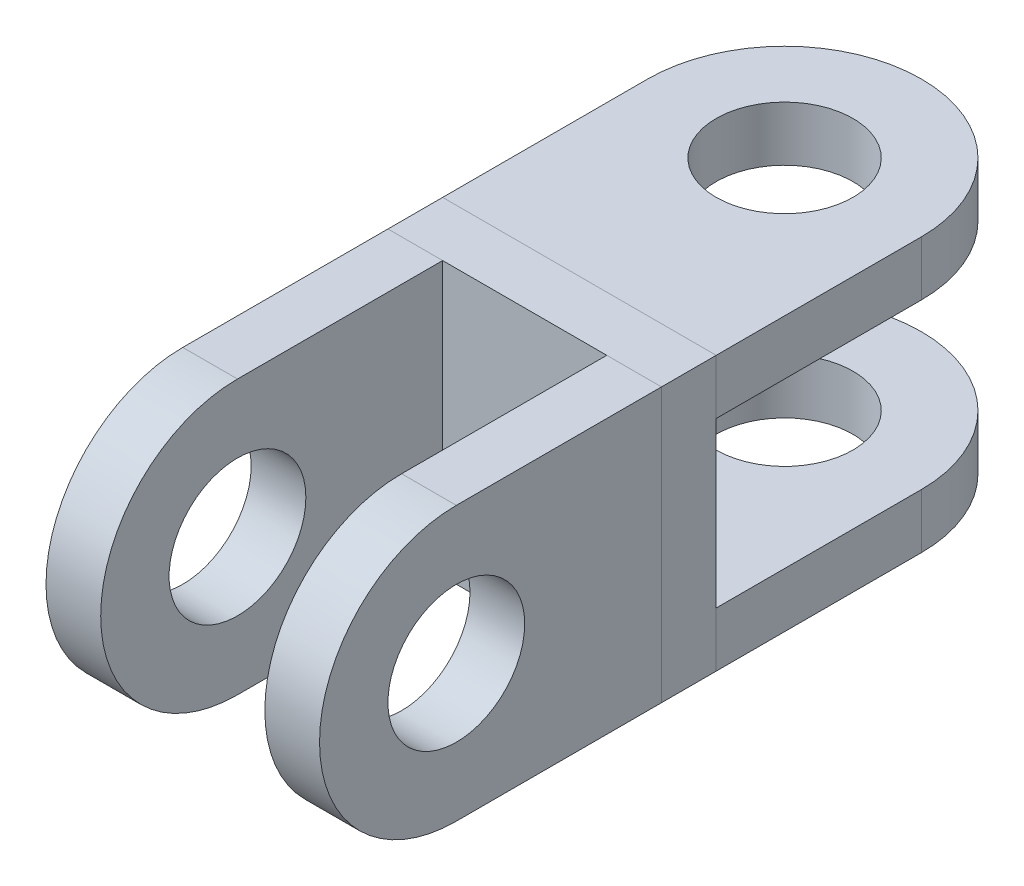
ISO-10303-21;
HEADER;
FILE_DESCRIPTION(('STEP AP214'),'2;1');
FILE_NAME('part.step','',(''),(''),'','','');
FILE_SCHEMA(('AUTOMOTIVE_DESIGN { 1 0 10303 214 1 1 1 1 }'));
ENDSEC;
DATA;
#1=APPLICATION_CONTEXT('core data for automotive mechanical design processes');
#2=APPLICATION_PROTOCOL_DEFINITION('international standard','automotive_design',2000,#1);
#3=PRODUCT_CONTEXT('',#1,'mechanical');
#4=PRODUCT('Part','Part','',(#3));
#5=PRODUCT_RELATED_PRODUCT_CATEGORY('part','',(#4));
#6=PRODUCT_DEFINITION_FORMATION('','',#4);
#7=PRODUCT_DEFINITION_CONTEXT('part definition',#1,'design');
#8=PRODUCT_DEFINITION('design','',#6,#7);
#9=PRODUCT_DEFINITION_SHAPE('','',#8);
#10=(LENGTH_UNIT() NAMED_UNIT(*) SI_UNIT(.MILLI.,.METRE.));
#11=(NAMED_UNIT(*) PLANE_ANGLE_UNIT() SI_UNIT($,.RADIAN.));
#12=(NAMED_UNIT(*) SI_UNIT($,.STERADIAN.) SOLID_ANGLE_UNIT());
#13=UNCERTAINTY_MEASURE_WITH_UNIT(LENGTH_MEASURE(1.E-05),#10,'distance_accuracy_value','');
#14=(GEOMETRIC_REPRESENTATION_CONTEXT(3) GLOBAL_UNCERTAINTY_ASSIGNED_CONTEXT((#13)) GLOBAL_UNIT_ASSIGNED_CONTEXT((#10,
#11,#12)) REPRESENTATION_CONTEXT('',''));
#15=CARTESIAN_POINT('',(0.,0.,0.));
#16=DIRECTION('',(0.,0.,1.));
#17=DIRECTION('',(1.,0.,0.));
#18=AXIS2_PLACEMENT_3D('',#15,#16,#17);
#19=CARTESIAN_POINT('',(0.,6.,-15.));
#20=DIRECTION('',(0.,-1.,0.));
#21=DIRECTION('',(0.,0.,1.));
#22=AXIS2_PLACEMENT_3D('',#19,#20,#21);
#23=PLANE('',#22);
#24=CARTESIAN_POINT('',(0.,6.,-15.));
#25=DIRECTION('',(0.,1.,0.));
#26=DIRECTION('',(0.,0.,1.));
#27=AXIS2_PLACEMENT_3D('',#24,#25,#26);
#28=CIRCLE('',#27,10.);
#29=CARTESIAN_POINT('',(10.,6.,-15.));
#30=VERTEX_POINT('',#29);
#31=CARTESIAN_POINT('',(-10.,6.,-15.));
#32=VERTEX_POINT('',#31);
#33=EDGE_CURVE('E103',#30,#32,#28,.T.);
#34=ORIENTED_EDGE('',*,*,#33,.F.);
#35=DIRECTION('',(0.,0.,-1.));
#36=VECTOR('',#35,1.);
#37=CARTESIAN_POINT('',(10.,6.,0.));
#38=LINE('',#37,#36);
#39=CARTESIAN_POINT('',(10.,6.,0.));
#40=VERTEX_POINT('',#39);
#41=EDGE_CURVE('E106',#40,#30,#38,.T.);
#42=ORIENTED_EDGE('',*,*,#41,.F.);
#43=DIRECTION('',(1.,0.,0.));
#44=VECTOR('',#43,1.);
#45=CARTESIAN_POINT('',(-10.,6.,0.));
#46=LINE('',#45,#44);
#47=CARTESIAN_POINT('',(-10.,6.,0.));
#48=VERTEX_POINT('',#47);
#49=EDGE_CURVE('E94',#48,#40,#46,.T.);
#50=ORIENTED_EDGE('',*,*,#49,.F.);
#51=DIRECTION('',(0.,0.,1.));
#52=VECTOR('',#51,1.);
#53=CARTESIAN_POINT('',(-10.,6.,-15.));
#54=LINE('',#53,#52);
#55=EDGE_CURVE('E99',#32,#48,#54,.T.);
#56=ORIENTED_EDGE('',*,*,#55,.F.);
#57=EDGE_LOOP('',(#34,#42,#50,#56));
#58=FACE_BOUND('',#57,.T.);
#59=CARTESIAN_POINT('',(0.,6.,-15.));
#60=DIRECTION('',(0.,1.,0.));
#61=DIRECTION('',(0.,0.,1.));
#62=AXIS2_PLACEMENT_3D('',#59,#60,#61);
#63=CIRCLE('',#62,5.);
#64=CARTESIAN_POINT('',(0.,6.,-10.));
#65=VERTEX_POINT('',#64);
#66=EDGE_CURVE('E115',#65,#65,#63,.T.);
#67=ORIENTED_EDGE('',*,*,#66,.T.);
#68=EDGE_LOOP('',(#67));
#69=FACE_BOUND('',#68,.T.);
#70=ADVANCED_FACE('F47',(#58,#69),#23,.T.);
#71=CARTESIAN_POINT('',(0.,10.,-15.));
#72=DIRECTION('',(0.,-1.,0.));
#73=DIRECTION('',(0.,0.,1.));
#74=AXIS2_PLACEMENT_3D('',#71,#72,#73);
#75=PLANE('',#74);
#76=CARTESIAN_POINT('',(0.,10.,-15.));
#77=DIRECTION('',(0.,1.,0.));
#78=DIRECTION('',(0.,0.,1.));
#79=AXIS2_PLACEMENT_3D('',#76,#77,#78);
#80=CIRCLE('',#79,10.);
#81=CARTESIAN_POINT('',(10.,10.,-15.));
#82=VERTEX_POINT('',#81);
#83=CARTESIAN_POINT('',(-10.,10.,-15.));
#84=VERTEX_POINT('',#83);
#85=EDGE_CURVE('E111',#82,#84,#80,.T.);
#86=ORIENTED_EDGE('',*,*,#85,.T.);
#87=DIRECTION('',(0.,0.,1.));
#88=VECTOR('',#87,1.);
#89=CARTESIAN_POINT('',(-10.,10.,-15.));
#90=LINE('',#89,#88);
#91=CARTESIAN_POINT('',(-10.,10.,0.));
#92=VERTEX_POINT('',#91);
#93=EDGE_CURVE('E114',#84,#92,#90,.T.);
#94=ORIENTED_EDGE('',*,*,#93,.T.);
#95=DIRECTION('',(1.,0.,0.));
#96=VECTOR('',#95,1.);
#97=CARTESIAN_POINT('',(-10.,10.,0.));
#98=LINE('',#97,#96);
#99=CARTESIAN_POINT('',(10.,10.,0.));
#100=VERTEX_POINT('',#99);
#101=EDGE_CURVE('E97',#92,#100,#98,.T.);
#102=ORIENTED_EDGE('',*,*,#101,.T.);
#103=DIRECTION('',(0.,0.,-1.));
#104=VECTOR('',#103,1.);
#105=CARTESIAN_POINT('',(10.,10.,0.));
#106=LINE('',#105,#104);
#107=EDGE_CURVE('E118',#100,#82,#106,.T.);
#108=ORIENTED_EDGE('',*,*,#107,.T.);
#109=EDGE_LOOP('',(#86,#94,#102,#108));
#110=FACE_BOUND('',#109,.T.);
#111=CARTESIAN_POINT('',(0.,10.,-15.));
#112=DIRECTION('',(0.,1.,0.));
#113=DIRECTION('',(0.,0.,1.));
#114=AXIS2_PLACEMENT_3D('',#111,#112,#113);
#115=CIRCLE('',#114,5.);
#116=CARTESIAN_POINT('',(0.,10.,-10.));
#117=VERTEX_POINT('',#116);
#118=EDGE_CURVE('E123',#117,#117,#115,.T.);
#119=ORIENTED_EDGE('',*,*,#118,.F.);
#120=EDGE_LOOP('',(#119));
#121=FACE_BOUND('',#120,.T.);
#122=ADVANCED_FACE('F136',(#110,#121),#75,.F.);
#123=CARTESIAN_POINT('',(0.,6.,-15.));
#124=DIRECTION('',(0.,1.,0.));
#125=DIRECTION('',(0.,0.,-1.));
#126=AXIS2_PLACEMENT_3D('',#123,#124,#125);
#127=CYLINDRICAL_SURFACE('',#126,10.);
#128=ORIENTED_EDGE('',*,*,#85,.F.);
#129=DIRECTION('',(0.,1.,0.));
#130=VECTOR('',#129,1.);
#131=CARTESIAN_POINT('',(10.,6.,-15.));
#132=LINE('',#131,#130);
#133=EDGE_CURVE('E64',#30,#82,#132,.T.);
#134=ORIENTED_EDGE('',*,*,#133,.F.);
#135=ORIENTED_EDGE('',*,*,#33,.T.);
#136=DIRECTION('',(0.,1.,0.));
#137=VECTOR('',#136,1.);
#138=CARTESIAN_POINT('',(-10.,6.,-15.));
#139=LINE('',#138,#137);
#140=EDGE_CURVE('E12',#32,#84,#139,.T.);
#141=ORIENTED_EDGE('',*,*,#140,.T.);
#142=EDGE_LOOP('',(#128,#134,#135,#141));
#143=FACE_BOUND('',#142,.T.);
#144=ADVANCED_FACE('F49',(#143),#127,.T.);
#145=CARTESIAN_POINT('',(-10.,6.,-15.));
#146=DIRECTION('',(1.,0.,0.));
#147=DIRECTION('',(0.,-1.,0.));
#148=AXIS2_PLACEMENT_3D('',#145,#146,#147);
#149=PLANE('',#148);
#150=ORIENTED_EDGE('',*,*,#93,.F.);
#151=ORIENTED_EDGE('',*,*,#140,.F.);
#152=ORIENTED_EDGE('',*,*,#55,.T.);
#153=DIRECTION('',(0.,1.,0.));
#154=VECTOR('',#153,1.);
#155=CARTESIAN_POINT('',(-10.,6.,0.));
#156=LINE('',#155,#154);
#157=EDGE_CURVE('E56',#48,#92,#156,.T.);
#158=ORIENTED_EDGE('',*,*,#157,.T.);
#159=EDGE_LOOP('',(#150,#151,#152,#158));
#160=FACE_BOUND('',#159,.T.);
#161=ADVANCED_FACE('F100',(#160),#149,.F.);
#162=CARTESIAN_POINT('',(-10.,6.,0.));
#163=DIRECTION('',(0.,0.,-1.));
#164=DIRECTION('',(0.,-1.,0.));
#165=AXIS2_PLACEMENT_3D('',#162,#163,#164);
#166=PLANE('',#165);
#167=ORIENTED_EDGE('',*,*,#101,.F.);
#168=ORIENTED_EDGE('',*,*,#157,.F.);
#169=ORIENTED_EDGE('',*,*,#49,.T.);
#170=DIRECTION('',(0.,1.,0.));
#171=VECTOR('',#170,1.);
#172=CARTESIAN_POINT('',(10.,6.,0.));
#173=LINE('',#172,#171);
#174=EDGE_CURVE('E80',#40,#100,#173,.T.);
#175=ORIENTED_EDGE('',*,*,#174,.T.);
#176=EDGE_LOOP('',(#167,#168,#169,#175));
#177=FACE_BOUND('',#176,.T.);
#178=ADVANCED_FACE('F92',(#177),#166,.F.);
#179=CARTESIAN_POINT('',(10.,6.,0.));
#180=DIRECTION('',(-1.,0.,0.));
#181=DIRECTION('',(0.,1.,0.));
#182=AXIS2_PLACEMENT_3D('',#179,#180,#181);
#183=PLANE('',#182);
#184=ORIENTED_EDGE('',*,*,#107,.F.);
#185=ORIENTED_EDGE('',*,*,#174,.F.);
#186=ORIENTED_EDGE('',*,*,#41,.T.);
#187=ORIENTED_EDGE('',*,*,#133,.T.);
#188=EDGE_LOOP('',(#184,#185,#186,#187));
#189=FACE_BOUND('',#188,.T.);
#190=ADVANCED_FACE('F132',(#189),#183,.F.);
#191=CARTESIAN_POINT('',(0.,6.,-15.));
#192=DIRECTION('',(0.,1.,0.));
#193=DIRECTION('',(0.,0.,-1.));
#194=AXIS2_PLACEMENT_3D('',#191,#192,#193);
#195=CYLINDRICAL_SURFACE('',#194,5.);
#196=ORIENTED_EDGE('',*,*,#66,.F.);
#197=EDGE_LOOP('',(#196));
#198=FACE_BOUND('',#197,.T.);
#199=ORIENTED_EDGE('',*,*,#118,.T.);
#200=EDGE_LOOP('',(#199));
#201=FACE_BOUND('',#200,.T.);
#202=ADVANCED_FACE('F129',(#198,#201),#195,.F.);
#203=CLOSED_SHELL('',(#70,#122,#144,#161,#178,#190,#202));
#204=MANIFOLD_SOLID_BREP('B2',#203);
#205=CARTESIAN_POINT('',(0.,-6.,-15.));
#206=DIRECTION('',(0.,1.,0.));
#207=DIRECTION('',(0.,0.,1.));
#208=AXIS2_PLACEMENT_3D('',#205,#206,#207);
#209=PLANE('',#208);
#210=CARTESIAN_POINT('',(0.,-6.,-15.));
#211=DIRECTION('',(0.,1.,0.));
#212=DIRECTION('',(0.,0.,1.));
#213=AXIS2_PLACEMENT_3D('',#210,#211,#212);
#214=CIRCLE('',#213,10.);
#215=CARTESIAN_POINT('',(10.,-6.,-15.));
#216=VERTEX_POINT('',#215);
#217=CARTESIAN_POINT('',(-10.,-6.,-15.));
#218=VERTEX_POINT('',#217);
#219=EDGE_CURVE('E253',#216,#218,#214,.T.);
#220=ORIENTED_EDGE('',*,*,#219,.T.);
#221=DIRECTION('',(0.,0.,1.));
#222=VECTOR('',#221,1.);
#223=CARTESIAN_POINT('',(-10.,-6.,-15.));
#224=LINE('',#223,#222);
#225=CARTESIAN_POINT('',(-10.,-6.,0.));
#226=VERTEX_POINT('',#225);
#227=EDGE_CURVE('E248',#218,#226,#224,.T.);
#228=ORIENTED_EDGE('',*,*,#227,.T.);
#229=DIRECTION('',(1.,0.,0.));
#230=VECTOR('',#229,1.);
#231=CARTESIAN_POINT('',(-10.,-6.,0.));
#232=LINE('',#231,#230);
#233=CARTESIAN_POINT('',(10.,-6.,0.));
#234=VERTEX_POINT('',#233);
#235=EDGE_CURVE('E251',#226,#234,#232,.T.);
#236=ORIENTED_EDGE('',*,*,#235,.T.);
#237=DIRECTION('',(0.,0.,-1.));
#238=VECTOR('',#237,1.);
#239=CARTESIAN_POINT('',(10.,-6.,0.));
#240=LINE('',#239,#238);
#241=EDGE_CURVE('E218',#234,#216,#240,.T.);
#242=ORIENTED_EDGE('',*,*,#241,.T.);
#243=EDGE_LOOP('',(#220,#228,#236,#242));
#244=FACE_BOUND('',#243,.T.);
#245=CARTESIAN_POINT('',(0.,-6.,-15.));
#246=DIRECTION('',(0.,1.,0.));
#247=DIRECTION('',(0.,0.,1.));
#248=AXIS2_PLACEMENT_3D('',#245,#246,#247);
#249=CIRCLE('',#248,5.);
#250=CARTESIAN_POINT('',(0.,-6.,-10.));
#251=VERTEX_POINT('',#250);
#252=EDGE_CURVE('E268',#251,#251,#249,.T.);
#253=ORIENTED_EDGE('',*,*,#252,.F.);
#254=EDGE_LOOP('',(#253));
#255=FACE_BOUND('',#254,.T.);
#256=ADVANCED_FACE('F201',(#244,#255),#209,.T.);
#257=CARTESIAN_POINT('',(0.,-10.,-15.));
#258=DIRECTION('',(0.,1.,0.));
#259=DIRECTION('',(0.,0.,1.));
#260=AXIS2_PLACEMENT_3D('',#257,#258,#259);
#261=PLANE('',#260);
#262=CARTESIAN_POINT('',(0.,-10.,-15.));
#263=DIRECTION('',(0.,1.,0.));
#264=DIRECTION('',(0.,0.,1.));
#265=AXIS2_PLACEMENT_3D('',#262,#263,#264);
#266=CIRCLE('',#265,10.);
#267=CARTESIAN_POINT('',(10.,-10.,-15.));
#268=VERTEX_POINT('',#267);
#269=CARTESIAN_POINT('',(-10.,-10.,-15.));
#270=VERTEX_POINT('',#269);
#271=EDGE_CURVE('E265',#268,#270,#266,.T.);
#272=ORIENTED_EDGE('',*,*,#271,.F.);
#273=DIRECTION('',(0.,0.,-1.));
#274=VECTOR('',#273,1.);
#275=CARTESIAN_POINT('',(10.,-10.,0.));
#276=LINE('',#275,#274);
#277=CARTESIAN_POINT('',(10.,-10.,0.));
#278=VERTEX_POINT('',#277);
#279=EDGE_CURVE('E241',#278,#268,#276,.T.);
#280=ORIENTED_EDGE('',*,*,#279,.F.);
#281=DIRECTION('',(1.,0.,0.));
#282=VECTOR('',#281,1.);
#283=CARTESIAN_POINT('',(-10.,-10.,0.));
#284=LINE('',#283,#282);
#285=CARTESIAN_POINT('',(-10.,-10.,0.));
#286=VERTEX_POINT('',#285);
#287=EDGE_CURVE('E235',#286,#278,#284,.T.);
#288=ORIENTED_EDGE('',*,*,#287,.F.);
#289=DIRECTION('',(0.,0.,1.));
#290=VECTOR('',#289,1.);
#291=CARTESIAN_POINT('',(-10.,-10.,-15.));
#292=LINE('',#291,#290);
#293=EDGE_CURVE('E257',#270,#286,#292,.T.);
#294=ORIENTED_EDGE('',*,*,#293,.F.);
#295=EDGE_LOOP('',(#272,#280,#288,#294));
#296=FACE_BOUND('',#295,.T.);
#297=CARTESIAN_POINT('',(0.,-10.,-15.));
#298=DIRECTION('',(0.,1.,0.));
#299=DIRECTION('',(0.,0.,1.));
#300=AXIS2_PLACEMENT_3D('',#297,#298,#299);
#301=CIRCLE('',#300,5.);
#302=CARTESIAN_POINT('',(0.,-10.,-10.));
#303=VERTEX_POINT('',#302);
#304=EDGE_CURVE('E280',#303,#303,#301,.T.);
#305=ORIENTED_EDGE('',*,*,#304,.T.);
#306=EDGE_LOOP('',(#305));
#307=FACE_BOUND('',#306,.T.);
#308=ADVANCED_FACE('F276',(#296,#307),#261,.F.);
#309=CARTESIAN_POINT('',(0.,-6.,-15.));
#310=DIRECTION('',(0.,-1.,0.));
#311=DIRECTION('',(0.,0.,-1.));
#312=AXIS2_PLACEMENT_3D('',#309,#310,#311);
#313=CYLINDRICAL_SURFACE('',#312,10.);
#314=ORIENTED_EDGE('',*,*,#271,.T.);
#315=DIRECTION('',(0.,-1.,0.));
#316=VECTOR('',#315,1.);
#317=CARTESIAN_POINT('',(-10.,-6.,-15.));
#318=LINE('',#317,#316);
#319=EDGE_CURVE('E45',#218,#270,#318,.T.);
#320=ORIENTED_EDGE('',*,*,#319,.F.);
#321=ORIENTED_EDGE('',*,*,#219,.F.);
#322=DIRECTION('',(0.,-1.,0.));
#323=VECTOR('',#322,1.);
#324=CARTESIAN_POINT('',(10.,-6.,-15.));
#325=LINE('',#324,#323);
#326=EDGE_CURVE('E261',#216,#268,#325,.T.);
#327=ORIENTED_EDGE('',*,*,#326,.T.);
#328=EDGE_LOOP('',(#314,#320,#321,#327));
#329=FACE_BOUND('',#328,.T.);
#330=ADVANCED_FACE('F203',(#329),#313,.T.);
#331=CARTESIAN_POINT('',(-10.,-6.,-15.));
#332=DIRECTION('',(1.,0.,0.));
#333=DIRECTION('',(0.,1.,0.));
#334=AXIS2_PLACEMENT_3D('',#331,#332,#333);
#335=PLANE('',#334);
#336=ORIENTED_EDGE('',*,*,#293,.T.);
#337=DIRECTION('',(0.,-1.,0.));
#338=VECTOR('',#337,1.);
#339=CARTESIAN_POINT('',(-10.,-6.,0.));
#340=LINE('',#339,#338);
#341=EDGE_CURVE('E210',#226,#286,#340,.T.);
#342=ORIENTED_EDGE('',*,*,#341,.F.);
#343=ORIENTED_EDGE('',*,*,#227,.F.);
#344=ORIENTED_EDGE('',*,*,#319,.T.);
#345=EDGE_LOOP('',(#336,#342,#343,#344));
#346=FACE_BOUND('',#345,.T.);
#347=ADVANCED_FACE('F256',(#346),#335,.F.);
#348=CARTESIAN_POINT('',(-10.,-6.,0.));
#349=DIRECTION('',(0.,0.,-1.));
#350=DIRECTION('',(0.,1.,0.));
#351=AXIS2_PLACEMENT_3D('',#348,#349,#350);
#352=PLANE('',#351);
#353=ORIENTED_EDGE('',*,*,#287,.T.);
#354=DIRECTION('',(0.,-1.,0.));
#355=VECTOR('',#354,1.);
#356=CARTESIAN_POINT('',(10.,-6.,0.));
#357=LINE('',#356,#355);
#358=EDGE_CURVE('E258',#234,#278,#357,.T.);
#359=ORIENTED_EDGE('',*,*,#358,.F.);
#360=ORIENTED_EDGE('',*,*,#235,.F.);
#361=ORIENTED_EDGE('',*,*,#341,.T.);
#362=EDGE_LOOP('',(#353,#359,#360,#361));
#363=FACE_BOUND('',#362,.T.);
#364=ADVANCED_FACE('F259',(#363),#352,.F.);
#365=CARTESIAN_POINT('',(10.,-6.,0.));
#366=DIRECTION('',(-1.,0.,0.));
#367=DIRECTION('',(0.,-1.,0.));
#368=AXIS2_PLACEMENT_3D('',#365,#366,#367);
#369=PLANE('',#368);
#370=ORIENTED_EDGE('',*,*,#279,.T.);
#371=ORIENTED_EDGE('',*,*,#326,.F.);
#372=ORIENTED_EDGE('',*,*,#241,.F.);
#373=ORIENTED_EDGE('',*,*,#358,.T.);
#374=EDGE_LOOP('',(#370,#371,#372,#373));
#375=FACE_BOUND('',#374,.T.);
#376=ADVANCED_FACE('F273',(#375),#369,.F.);
#377=CARTESIAN_POINT('',(0.,-6.,-15.));
#378=DIRECTION('',(0.,-1.,0.));
#379=DIRECTION('',(0.,0.,-1.));
#380=AXIS2_PLACEMENT_3D('',#377,#378,#379);
#381=CYLINDRICAL_SURFACE('',#380,5.);
#382=ORIENTED_EDGE('',*,*,#252,.T.);
#383=EDGE_LOOP('',(#382));
#384=FACE_BOUND('',#383,.T.);
#385=ORIENTED_EDGE('',*,*,#304,.F.);
#386=EDGE_LOOP('',(#385));
#387=FACE_BOUND('',#386,.T.);
#388=ADVANCED_FACE('F286',(#384,#387),#381,.F.);
#389=CLOSED_SHELL('',(#256,#308,#330,#347,#364,#376,#388));
#390=MANIFOLD_SOLID_BREP('B6',#389);
#391=CARTESIAN_POINT('',(10.,0.,19.));
#392=DIRECTION('',(1.,0.,0.));
#393=DIRECTION('',(0.,0.,-1.));
#394=AXIS2_PLACEMENT_3D('',#391,#392,#393);
#395=PLANE('',#394);
#396=CARTESIAN_POINT('',(10.,0.,19.));
#397=DIRECTION('',(-1.,0.,0.));
#398=DIRECTION('',(0.,0.,-1.));
#399=AXIS2_PLACEMENT_3D('',#396,#397,#398);
#400=CIRCLE('',#399,10.);
#401=CARTESIAN_POINT('',(10.,-10.,19.));
#402=VERTEX_POINT('',#401);
#403=CARTESIAN_POINT('',(10.,10.,19.));
#404=VERTEX_POINT('',#403);
#405=EDGE_CURVE('E411',#402,#404,#400,.T.);
#406=ORIENTED_EDGE('',*,*,#405,.F.);
#407=DIRECTION('',(0.,0.,1.));
#408=VECTOR('',#407,1.);
#409=CARTESIAN_POINT('',(10.,-10.,4.));
#410=LINE('',#409,#408);
#411=CARTESIAN_POINT('',(10.,-10.,4.));
#412=VERTEX_POINT('',#411);
#413=EDGE_CURVE('E414',#412,#402,#410,.T.);
#414=ORIENTED_EDGE('',*,*,#413,.F.);
#415=DIRECTION('',(0.,-1.,0.));
#416=VECTOR('',#415,1.);
#417=CARTESIAN_POINT('',(10.,10.,4.));
#418=LINE('',#417,#416);
#419=CARTESIAN_POINT('',(10.,10.,4.));
#420=VERTEX_POINT('',#419);
#421=EDGE_CURVE('E402',#420,#412,#418,.T.);
#422=ORIENTED_EDGE('',*,*,#421,.F.);
#423=DIRECTION('',(0.,0.,-1.));
#424=VECTOR('',#423,1.);
#425=CARTESIAN_POINT('',(10.,10.,19.));
#426=LINE('',#425,#424);
#427=EDGE_CURVE('E407',#404,#420,#426,.T.);
#428=ORIENTED_EDGE('',*,*,#427,.F.);
#429=EDGE_LOOP('',(#406,#414,#422,#428));
#430=FACE_BOUND('',#429,.T.);
#431=CARTESIAN_POINT('',(10.,0.,19.));
#432=DIRECTION('',(-1.,0.,0.));
#433=DIRECTION('',(0.,0.,-1.));
#434=AXIS2_PLACEMENT_3D('',#431,#432,#433);
#435=CIRCLE('',#434,5.);
#436=CARTESIAN_POINT('',(10.,0.,14.));
#437=VERTEX_POINT('',#436);
#438=EDGE_CURVE('E423',#437,#437,#435,.T.);
#439=ORIENTED_EDGE('',*,*,#438,.T.);
#440=EDGE_LOOP('',(#439));
#441=FACE_BOUND('',#440,.T.);
#442=ADVANCED_FACE('F355',(#430,#441),#395,.T.);
#443=CARTESIAN_POINT('',(6.,0.,19.));
#444=DIRECTION('',(1.,0.,0.));
#445=DIRECTION('',(0.,0.,-1.));
#446=AXIS2_PLACEMENT_3D('',#443,#444,#445);
#447=PLANE('',#446);
#448=CARTESIAN_POINT('',(6.,0.,19.));
#449=DIRECTION('',(-1.,0.,0.));
#450=DIRECTION('',(0.,0.,-1.));
#451=AXIS2_PLACEMENT_3D('',#448,#449,#450);
#452=CIRCLE('',#451,10.);
#453=CARTESIAN_POINT('',(6.,-10.,19.));
#454=VERTEX_POINT('',#453);
#455=CARTESIAN_POINT('',(6.,10.,19.));
#456=VERTEX_POINT('',#455);
#457=EDGE_CURVE('E419',#454,#456,#452,.T.);
#458=ORIENTED_EDGE('',*,*,#457,.T.);
#459=DIRECTION('',(0.,0.,-1.));
#460=VECTOR('',#459,1.);
#461=CARTESIAN_POINT('',(6.,10.,19.));
#462=LINE('',#461,#460);
#463=CARTESIAN_POINT('',(6.,10.,4.));
#464=VERTEX_POINT('',#463);
#465=EDGE_CURVE('E422',#456,#464,#462,.T.);
#466=ORIENTED_EDGE('',*,*,#465,.T.);
#467=DIRECTION('',(0.,-1.,0.));
#468=VECTOR('',#467,1.);
#469=CARTESIAN_POINT('',(6.,10.,4.));
#470=LINE('',#469,#468);
#471=CARTESIAN_POINT('',(6.,-10.,4.));
#472=VERTEX_POINT('',#471);
#473=EDGE_CURVE('E405',#464,#472,#470,.T.);
#474=ORIENTED_EDGE('',*,*,#473,.T.);
#475=DIRECTION('',(0.,0.,1.));
#476=VECTOR('',#475,1.);
#477=CARTESIAN_POINT('',(6.,-10.,4.));
#478=LINE('',#477,#476);
#479=EDGE_CURVE('E426',#472,#454,#478,.T.);
#480=ORIENTED_EDGE('',*,*,#479,.T.);
#481=EDGE_LOOP('',(#458,#466,#474,#480));
#482=FACE_BOUND('',#481,.T.);
#483=CARTESIAN_POINT('',(6.,0.,19.));
#484=DIRECTION('',(-1.,0.,0.));
#485=DIRECTION('',(0.,0.,-1.));
#486=AXIS2_PLACEMENT_3D('',#483,#484,#485);
#487=CIRCLE('',#486,5.);
#488=CARTESIAN_POINT('',(6.,0.,14.));
#489=VERTEX_POINT('',#488);
#490=EDGE_CURVE('E431',#489,#489,#487,.T.);
#491=ORIENTED_EDGE('',*,*,#490,.F.);
#492=EDGE_LOOP('',(#491));
#493=FACE_BOUND('',#492,.T.);
#494=ADVANCED_FACE('F444',(#482,#493),#447,.F.);
#495=CARTESIAN_POINT('',(10.,0.,19.));
#496=DIRECTION('',(-1.,0.,0.));
#497=DIRECTION('',(0.,0.,1.));
#498=AXIS2_PLACEMENT_3D('',#495,#496,#497);
#499=CYLINDRICAL_SURFACE('',#498,10.);
#500=ORIENTED_EDGE('',*,*,#457,.F.);
#501=DIRECTION('',(-1.,0.,0.));
#502=VECTOR('',#501,1.);
#503=CARTESIAN_POINT('',(10.,-10.,19.));
#504=LINE('',#503,#502);
#505=EDGE_CURVE('E372',#402,#454,#504,.T.);
#506=ORIENTED_EDGE('',*,*,#505,.F.);
#507=ORIENTED_EDGE('',*,*,#405,.T.);
#508=DIRECTION('',(-1.,0.,0.));
#509=VECTOR('',#508,1.);
#510=CARTESIAN_POINT('',(10.,10.,19.));
#511=LINE('',#510,#509);
#512=EDGE_CURVE('E199',#404,#456,#511,.T.);
#513=ORIENTED_EDGE('',*,*,#512,.T.);
#514=EDGE_LOOP('',(#500,#506,#507,#513));
#515=FACE_BOUND('',#514,.T.);
#516=ADVANCED_FACE('F357',(#515),#499,.T.);
#517=CARTESIAN_POINT('',(10.,10.,19.));
#518=DIRECTION('',(0.,-1.,0.));
#519=DIRECTION('',(1.,0.,0.));
#520=AXIS2_PLACEMENT_3D('',#517,#518,#519);
#521=PLANE('',#520);
#522=ORIENTED_EDGE('',*,*,#465,.F.);
#523=ORIENTED_EDGE('',*,*,#512,.F.);
#524=ORIENTED_EDGE('',*,*,#427,.T.);
#525=DIRECTION('',(-1.,0.,0.));
#526=VECTOR('',#525,1.);
#527=CARTESIAN_POINT('',(10.,10.,4.));
#528=LINE('',#527,#526);
#529=EDGE_CURVE('E364',#420,#464,#528,.T.);
#530=ORIENTED_EDGE('',*,*,#529,.T.);
#531=EDGE_LOOP('',(#522,#523,#524,#530));
#532=FACE_BOUND('',#531,.T.);
#533=ADVANCED_FACE('F408',(#532),#521,.F.);
#534=CARTESIAN_POINT('',(10.,10.,4.));
#535=DIRECTION('',(0.,0.,1.));
#536=DIRECTION('',(1.,0.,0.));
#537=AXIS2_PLACEMENT_3D('',#534,#535,#536);
#538=PLANE('',#537);
#539=ORIENTED_EDGE('',*,*,#473,.F.);
#540=ORIENTED_EDGE('',*,*,#529,.F.);
#541=ORIENTED_EDGE('',*,*,#421,.T.);
#542=DIRECTION('',(-1.,0.,0.));
#543=VECTOR('',#542,1.);
#544=CARTESIAN_POINT('',(10.,-10.,4.));
#545=LINE('',#544,#543);
#546=EDGE_CURVE('E388',#412,#472,#545,.T.);
#547=ORIENTED_EDGE('',*,*,#546,.T.);
#548=EDGE_LOOP('',(#539,#540,#541,#547));
#549=FACE_BOUND('',#548,.T.);
#550=ADVANCED_FACE('F400',(#549),#538,.F.);
#551=CARTESIAN_POINT('',(10.,-10.,4.));
#552=DIRECTION('',(0.,1.,0.));
#553=DIRECTION('',(-1.,0.,0.));
#554=AXIS2_PLACEMENT_3D('',#551,#552,#553);
#555=PLANE('',#554);
#556=ORIENTED_EDGE('',*,*,#479,.F.);
#557=ORIENTED_EDGE('',*,*,#546,.F.);
#558=ORIENTED_EDGE('',*,*,#413,.T.);
#559=ORIENTED_EDGE('',*,*,#505,.T.);
#560=EDGE_LOOP('',(#556,#557,#558,#559));
#561=FACE_BOUND('',#560,.T.);
#562=ADVANCED_FACE('F440',(#561),#555,.F.);
#563=CARTESIAN_POINT('',(10.,0.,19.));
#564=DIRECTION('',(-1.,0.,0.));
#565=DIRECTION('',(0.,0.,1.));
#566=AXIS2_PLACEMENT_3D('',#563,#564,#565);
#567=CYLINDRICAL_SURFACE('',#566,5.);
#568=ORIENTED_EDGE('',*,*,#438,.F.);
#569=EDGE_LOOP('',(#568));
#570=FACE_BOUND('',#569,.T.);
#571=ORIENTED_EDGE('',*,*,#490,.T.);
#572=EDGE_LOOP('',(#571));
#573=FACE_BOUND('',#572,.T.);
#574=ADVANCED_FACE('F437',(#570,#573),#567,.F.);
#575=CLOSED_SHELL('',(#442,#494,#516,#533,#550,#562,#574));
#576=MANIFOLD_SOLID_BREP('B39',#575);
#577=CARTESIAN_POINT('',(-10.,0.,19.));
#578=DIRECTION('',(-1.,0.,0.));
#579=DIRECTION('',(0.,0.,-1.));
#580=AXIS2_PLACEMENT_3D('',#577,#578,#579);
#581=PLANE('',#580);
#582=CARTESIAN_POINT('',(-10.,0.,19.));
#583=DIRECTION('',(-1.,0.,0.));
#584=DIRECTION('',(0.,0.,-1.));
#585=AXIS2_PLACEMENT_3D('',#582,#583,#584);
#586=CIRCLE('',#585,10.);
#587=CARTESIAN_POINT('',(-10.,-10.,19.));
#588=VERTEX_POINT('',#587);
#589=CARTESIAN_POINT('',(-10.,10.,19.));
#590=VERTEX_POINT('',#589);
#591=EDGE_CURVE('E560',#588,#590,#586,.T.);
#592=ORIENTED_EDGE('',*,*,#591,.T.);
#593=DIRECTION('',(0.,0.,-1.));
#594=VECTOR('',#593,1.);
#595=CARTESIAN_POINT('',(-10.,10.,19.));
#596=LINE('',#595,#594);
#597=CARTESIAN_POINT('',(-10.,10.,4.));
#598=VERTEX_POINT('',#597);
#599=EDGE_CURVE('E555',#590,#598,#596,.T.);
#600=ORIENTED_EDGE('',*,*,#599,.T.);
#601=DIRECTION('',(0.,-1.,0.));
#602=VECTOR('',#601,1.);
#603=CARTESIAN_POINT('',(-10.,10.,4.));
#604=LINE('',#603,#602);
#605=CARTESIAN_POINT('',(-10.,-10.,4.));
#606=VERTEX_POINT('',#605);
#607=EDGE_CURVE('E558',#598,#606,#604,.T.);
#608=ORIENTED_EDGE('',*,*,#607,.T.);
#609=DIRECTION('',(0.,0.,1.));
#610=VECTOR('',#609,1.);
#611=CARTESIAN_POINT('',(-10.,-10.,4.));
#612=LINE('',#611,#610);
#613=EDGE_CURVE('E525',#606,#588,#612,.T.);
#614=ORIENTED_EDGE('',*,*,#613,.T.);
#615=EDGE_LOOP('',(#592,#600,#608,#614));
#616=FACE_BOUND('',#615,.T.);
#617=CARTESIAN_POINT('',(-10.,0.,19.));
#618=DIRECTION('',(-1.,0.,0.));
#619=DIRECTION('',(0.,0.,-1.));
#620=AXIS2_PLACEMENT_3D('',#617,#618,#619);
#621=CIRCLE('',#620,5.);
#622=CARTESIAN_POINT('',(-10.,0.,14.));
#623=VERTEX_POINT('',#622);
#624=EDGE_CURVE('E575',#623,#623,#621,.T.);
#625=ORIENTED_EDGE('',*,*,#624,.F.);
#626=EDGE_LOOP('',(#625));
#627=FACE_BOUND('',#626,.T.);
#628=ADVANCED_FACE('F508',(#616,#627),#581,.T.);
#629=CARTESIAN_POINT('',(-6.,0.,19.));
#630=DIRECTION('',(-1.,0.,0.));
#631=DIRECTION('',(0.,0.,-1.));
#632=AXIS2_PLACEMENT_3D('',#629,#630,#631);
#633=PLANE('',#632);
#634=CARTESIAN_POINT('',(-6.,0.,19.));
#635=DIRECTION('',(-1.,0.,0.));
#636=DIRECTION('',(0.,0.,-1.));
#637=AXIS2_PLACEMENT_3D('',#634,#635,#636);
#638=CIRCLE('',#637,10.);
#639=CARTESIAN_POINT('',(-6.,-10.,19.));
#640=VERTEX_POINT('',#639);
#641=CARTESIAN_POINT('',(-6.,10.,19.));
#642=VERTEX_POINT('',#641);
#643=EDGE_CURVE('E572',#640,#642,#638,.T.);
#644=ORIENTED_EDGE('',*,*,#643,.F.);
#645=DIRECTION('',(0.,0.,1.));
#646=VECTOR('',#645,1.);
#647=CARTESIAN_POINT('',(-6.,-10.,4.));
#648=LINE('',#647,#646);
#649=CARTESIAN_POINT('',(-6.,-10.,4.));
#650=VERTEX_POINT('',#649);
#651=EDGE_CURVE('E548',#650,#640,#648,.T.);
#652=ORIENTED_EDGE('',*,*,#651,.F.);
#653=DIRECTION('',(0.,-1.,0.));
#654=VECTOR('',#653,1.);
#655=CARTESIAN_POINT('',(-6.,10.,4.));
#656=LINE('',#655,#654);
#657=CARTESIAN_POINT('',(-6.,10.,4.));
#658=VERTEX_POINT('',#657);
#659=EDGE_CURVE('E542',#658,#650,#656,.T.);
#660=ORIENTED_EDGE('',*,*,#659,.F.);
#661=DIRECTION('',(0.,0.,-1.));
#662=VECTOR('',#661,1.);
#663=CARTESIAN_POINT('',(-6.,10.,19.));
#664=LINE('',#663,#662);
#665=EDGE_CURVE('E564',#642,#658,#664,.T.);
#666=ORIENTED_EDGE('',*,*,#665,.F.);
#667=EDGE_LOOP('',(#644,#652,#660,#666));
#668=FACE_BOUND('',#667,.T.);
#669=CARTESIAN_POINT('',(-6.,0.,19.));
#670=DIRECTION('',(-1.,0.,0.));
#671=DIRECTION('',(0.,0.,-1.));
#672=AXIS2_PLACEMENT_3D('',#669,#670,#671);
#673=CIRCLE('',#672,5.);
#674=CARTESIAN_POINT('',(-6.,0.,14.));
#675=VERTEX_POINT('',#674);
#676=EDGE_CURVE('E587',#675,#675,#673,.T.);
#677=ORIENTED_EDGE('',*,*,#676,.T.);
#678=EDGE_LOOP('',(#677));
#679=FACE_BOUND('',#678,.T.);
#680=ADVANCED_FACE('F583',(#668,#679),#633,.F.);
#681=CARTESIAN_POINT('',(-10.,0.,19.));
#682=DIRECTION('',(1.,0.,0.));
#683=DIRECTION('',(0.,0.,1.));
#684=AXIS2_PLACEMENT_3D('',#681,#682,#683);
#685=CYLINDRICAL_SURFACE('',#684,10.);
#686=ORIENTED_EDGE('',*,*,#643,.T.);
#687=DIRECTION('',(1.,0.,0.));
#688=VECTOR('',#687,1.);
#689=CARTESIAN_POINT('',(-10.,10.,19.));
#690=LINE('',#689,#688);
#691=EDGE_CURVE('E353',#590,#642,#690,.T.);
#692=ORIENTED_EDGE('',*,*,#691,.F.);
#693=ORIENTED_EDGE('',*,*,#591,.F.);
#694=DIRECTION('',(1.,0.,0.));
#695=VECTOR('',#694,1.);
#696=CARTESIAN_POINT('',(-10.,-10.,19.));
#697=LINE('',#696,#695);
#698=EDGE_CURVE('E568',#588,#640,#697,.T.);
#699=ORIENTED_EDGE('',*,*,#698,.T.);
#700=EDGE_LOOP('',(#686,#692,#693,#699));
#701=FACE_BOUND('',#700,.T.);
#702=ADVANCED_FACE('F510',(#701),#685,.T.);
#703=CARTESIAN_POINT('',(-10.,10.,19.));
#704=DIRECTION('',(0.,-1.,0.));
#705=DIRECTION('',(-1.,0.,0.));
#706=AXIS2_PLACEMENT_3D('',#703,#704,#705);
#707=PLANE('',#706);
#708=ORIENTED_EDGE('',*,*,#665,.T.);
#709=DIRECTION('',(1.,0.,0.));
#710=VECTOR('',#709,1.);
#711=CARTESIAN_POINT('',(-10.,10.,4.));
#712=LINE('',#711,#710);
#713=EDGE_CURVE('E517',#598,#658,#712,.T.);
#714=ORIENTED_EDGE('',*,*,#713,.F.);
#715=ORIENTED_EDGE('',*,*,#599,.F.);
#716=ORIENTED_EDGE('',*,*,#691,.T.);
#717=EDGE_LOOP('',(#708,#714,#715,#716));
#718=FACE_BOUND('',#717,.T.);
#719=ADVANCED_FACE('F563',(#718),#707,.F.);
#720=CARTESIAN_POINT('',(-10.,10.,4.));
#721=DIRECTION('',(0.,0.,1.));
#722=DIRECTION('',(-1.,0.,0.));
#723=AXIS2_PLACEMENT_3D('',#720,#721,#722);
#724=PLANE('',#723);
#725=ORIENTED_EDGE('',*,*,#659,.T.);
#726=DIRECTION('',(1.,0.,0.));
#727=VECTOR('',#726,1.);
#728=CARTESIAN_POINT('',(-10.,-10.,4.));
#729=LINE('',#728,#727);
#730=EDGE_CURVE('E565',#606,#650,#729,.T.);
#731=ORIENTED_EDGE('',*,*,#730,.F.);
#732=ORIENTED_EDGE('',*,*,#607,.F.);
#733=ORIENTED_EDGE('',*,*,#713,.T.);
#734=EDGE_LOOP('',(#725,#731,#732,#733));
#735=FACE_BOUND('',#734,.T.);
#736=ADVANCED_FACE('F566',(#735),#724,.F.);
#737=CARTESIAN_POINT('',(-10.,-10.,4.));
#738=DIRECTION('',(0.,1.,0.));
#739=DIRECTION('',(1.,0.,0.));
#740=AXIS2_PLACEMENT_3D('',#737,#738,#739);
#741=PLANE('',#740);
#742=ORIENTED_EDGE('',*,*,#651,.T.);
#743=ORIENTED_EDGE('',*,*,#698,.F.);
#744=ORIENTED_EDGE('',*,*,#613,.F.);
#745=ORIENTED_EDGE('',*,*,#730,.T.);
#746=EDGE_LOOP('',(#742,#743,#744,#745));
#747=FACE_BOUND('',#746,.T.);
#748=ADVANCED_FACE('F580',(#747),#741,.F.);
#749=CARTESIAN_POINT('',(-10.,0.,19.));
#750=DIRECTION('',(1.,0.,0.));
#751=DIRECTION('',(0.,0.,1.));
#752=AXIS2_PLACEMENT_3D('',#749,#750,#751);
#753=CYLINDRICAL_SURFACE('',#752,5.);
#754=ORIENTED_EDGE('',*,*,#624,.T.);
#755=EDGE_LOOP('',(#754));
#756=FACE_BOUND('',#755,.T.);
#757=ORIENTED_EDGE('',*,*,#676,.F.);
#758=EDGE_LOOP('',(#757));
#759=FACE_BOUND('',#758,.T.);
#760=ADVANCED_FACE('F593',(#756,#759),#753,.F.);
#761=CLOSED_SHELL('',(#628,#680,#702,#719,#736,#748,#760));
#762=MANIFOLD_SOLID_BREP('B193',#761);
#763=CARTESIAN_POINT('',(-10.,10.,4.));
#764=DIRECTION('',(0.,1.,0.));
#765=DIRECTION('',(0.,0.,1.));
#766=AXIS2_PLACEMENT_3D('',#763,#764,#765);
#767=PLANE('',#766);
#768=DIRECTION('',(1.,0.,0.));
#769=VECTOR('',#768,1.);
#770=CARTESIAN_POINT('',(-10.,10.,0.));
#771=LINE('',#770,#769);
#772=CARTESIAN_POINT('',(-10.,10.,0.));
#773=VERTEX_POINT('',#772);
#774=CARTESIAN_POINT('',(10.,10.,0.));
#775=VERTEX_POINT('',#774);
#776=EDGE_CURVE('E716',#773,#775,#771,.T.);
#777=ORIENTED_EDGE('',*,*,#776,.F.);
#778=DIRECTION('',(0.,0.,-1.));
#779=VECTOR('',#778,1.);
#780=CARTESIAN_POINT('',(-10.,10.,4.));
#781=LINE('',#780,#779);
#782=CARTESIAN_POINT('',(-10.,10.,4.));
#783=VERTEX_POINT('',#782);
#784=EDGE_CURVE('E506',#783,#773,#781,.T.);
#785=ORIENTED_EDGE('',*,*,#784,.F.);
#786=DIRECTION('',(1.,0.,0.));
#787=VECTOR('',#786,1.);
#788=CARTESIAN_POINT('',(-10.,10.,4.));
#789=LINE('',#788,#787);
#790=CARTESIAN_POINT('',(10.,10.,4.));
#791=VERTEX_POINT('',#790);
#792=EDGE_CURVE('E710',#783,#791,#789,.T.);
#793=ORIENTED_EDGE('',*,*,#792,.T.);
#794=DIRECTION('',(0.,0.,-1.));
#795=VECTOR('',#794,1.);
#796=CARTESIAN_POINT('',(10.,10.,4.));
#797=LINE('',#796,#795);
#798=EDGE_CURVE('E655',#791,#775,#797,.T.);
#799=ORIENTED_EDGE('',*,*,#798,.T.);
#800=EDGE_LOOP('',(#777,#785,#793,#799));
#801=FACE_BOUND('',#800,.T.);
#802=ADVANCED_FACE('F652',(#801),#767,.T.);
#803=CARTESIAN_POINT('',(-10.,-10.,4.));
#804=DIRECTION('',(-1.,0.,0.));
#805=DIRECTION('',(0.,0.,1.));
#806=AXIS2_PLACEMENT_3D('',#803,#804,#805);
#807=PLANE('',#806);
#808=DIRECTION('',(0.,1.,0.));
#809=VECTOR('',#808,1.);
#810=CARTESIAN_POINT('',(-10.,-10.,0.));
#811=LINE('',#810,#809);
#812=CARTESIAN_POINT('',(-10.,-10.,0.));
#813=VERTEX_POINT('',#812);
#814=EDGE_CURVE('E712',#813,#773,#811,.T.);
#815=ORIENTED_EDGE('',*,*,#814,.F.);
#816=DIRECTION('',(0.,0.,-1.));
#817=VECTOR('',#816,1.);
#818=CARTESIAN_POINT('',(-10.,-10.,4.));
#819=LINE('',#818,#817);
#820=CARTESIAN_POINT('',(-10.,-10.,4.));
#821=VERTEX_POINT('',#820);
#822=EDGE_CURVE('E661',#821,#813,#819,.T.);
#823=ORIENTED_EDGE('',*,*,#822,.F.);
#824=DIRECTION('',(0.,1.,0.));
#825=VECTOR('',#824,1.);
#826=CARTESIAN_POINT('',(-10.,-10.,4.));
#827=LINE('',#826,#825);
#828=EDGE_CURVE('E700',#821,#783,#827,.T.);
#829=ORIENTED_EDGE('',*,*,#828,.T.);
#830=ORIENTED_EDGE('',*,*,#784,.T.);
#831=EDGE_LOOP('',(#815,#823,#829,#830));
#832=FACE_BOUND('',#831,.T.);
#833=ADVANCED_FACE('F726',(#832),#807,.T.);
#834=CARTESIAN_POINT('',(-10.,-10.,4.));
#835=DIRECTION('',(0.,1.,0.));
#836=DIRECTION('',(0.,0.,1.));
#837=AXIS2_PLACEMENT_3D('',#834,#835,#836);
#838=PLANE('',#837);
#839=DIRECTION('',(1.,0.,0.));
#840=VECTOR('',#839,1.);
#841=CARTESIAN_POINT('',(-10.,-10.,0.));
#842=LINE('',#841,#840);
#843=CARTESIAN_POINT('',(10.,-10.,0.));
#844=VERTEX_POINT('',#843);
#845=EDGE_CURVE('E705',#813,#844,#842,.T.);
#846=ORIENTED_EDGE('',*,*,#845,.T.);
#847=DIRECTION('',(0.,0.,-1.));
#848=VECTOR('',#847,1.);
#849=CARTESIAN_POINT('',(10.,-10.,4.));
#850=LINE('',#849,#848);
#851=CARTESIAN_POINT('',(10.,-10.,4.));
#852=VERTEX_POINT('',#851);
#853=EDGE_CURVE('E703',#852,#844,#850,.T.);
#854=ORIENTED_EDGE('',*,*,#853,.F.);
#855=DIRECTION('',(1.,0.,0.));
#856=VECTOR('',#855,1.);
#857=CARTESIAN_POINT('',(-10.,-10.,4.));
#858=LINE('',#857,#856);
#859=EDGE_CURVE('E697',#821,#852,#858,.T.);
#860=ORIENTED_EDGE('',*,*,#859,.F.);
#861=ORIENTED_EDGE('',*,*,#822,.T.);
#862=EDGE_LOOP('',(#846,#854,#860,#861));
#863=FACE_BOUND('',#862,.T.);
#864=ADVANCED_FACE('F704',(#863),#838,.F.);
#865=CARTESIAN_POINT('',(10.,-10.,4.));
#866=DIRECTION('',(-1.,0.,0.));
#867=DIRECTION('',(0.,0.,1.));
#868=AXIS2_PLACEMENT_3D('',#865,#866,#867);
#869=PLANE('',#868);
#870=DIRECTION('',(0.,1.,0.));
#871=VECTOR('',#870,1.);
#872=CARTESIAN_POINT('',(10.,-10.,0.));
#873=LINE('',#872,#871);
#874=EDGE_CURVE('E719',#844,#775,#873,.T.);
#875=ORIENTED_EDGE('',*,*,#874,.T.);
#876=ORIENTED_EDGE('',*,*,#798,.F.);
#877=DIRECTION('',(0.,1.,0.));
#878=VECTOR('',#877,1.);
#879=CARTESIAN_POINT('',(10.,-10.,4.));
#880=LINE('',#879,#878);
#881=EDGE_CURVE('E694',#852,#791,#880,.T.);
#882=ORIENTED_EDGE('',*,*,#881,.F.);
#883=ORIENTED_EDGE('',*,*,#853,.T.);
#884=EDGE_LOOP('',(#875,#876,#882,#883));
#885=FACE_BOUND('',#884,.T.);
#886=ADVANCED_FACE('F709',(#885),#869,.F.);
#887=CARTESIAN_POINT('',(0.,0.,4.));
#888=DIRECTION('',(0.,0.,1.));
#889=DIRECTION('',(1.,0.,0.));
#890=AXIS2_PLACEMENT_3D('',#887,#888,#889);
#891=PLANE('',#890);
#892=ORIENTED_EDGE('',*,*,#792,.F.);
#893=ORIENTED_EDGE('',*,*,#828,.F.);
#894=ORIENTED_EDGE('',*,*,#859,.T.);
#895=ORIENTED_EDGE('',*,*,#881,.T.);
#896=EDGE_LOOP('',(#892,#893,#894,#895));
#897=FACE_BOUND('',#896,.T.);
#898=ADVANCED_FACE('F699',(#897),#891,.T.);
#899=CARTESIAN_POINT('',(0.,0.,0.));
#900=DIRECTION('',(0.,0.,1.));
#901=DIRECTION('',(1.,0.,0.));
#902=AXIS2_PLACEMENT_3D('',#899,#900,#901);
#903=PLANE('',#902);
#904=ORIENTED_EDGE('',*,*,#776,.T.);
#905=ORIENTED_EDGE('',*,*,#874,.F.);
#906=ORIENTED_EDGE('',*,*,#845,.F.);
#907=ORIENTED_EDGE('',*,*,#814,.T.);
#908=EDGE_LOOP('',(#904,#905,#906,#907));
#909=FACE_BOUND('',#908,.T.);
#910=ADVANCED_FACE('F725',(#909),#903,.F.);
#911=CLOSED_SHELL('',(#802,#833,#864,#886,#898,#910));
#912=MANIFOLD_SOLID_BREP('B347',#911);
#913=ADVANCED_BREP_SHAPE_REPRESENTATION('',(#18,#204,#390,#576,#762,#912),#14);
#914=SHAPE_DEFINITION_REPRESENTATION(#9,#913);
ENDSEC;
END-ISO-10303-21;
